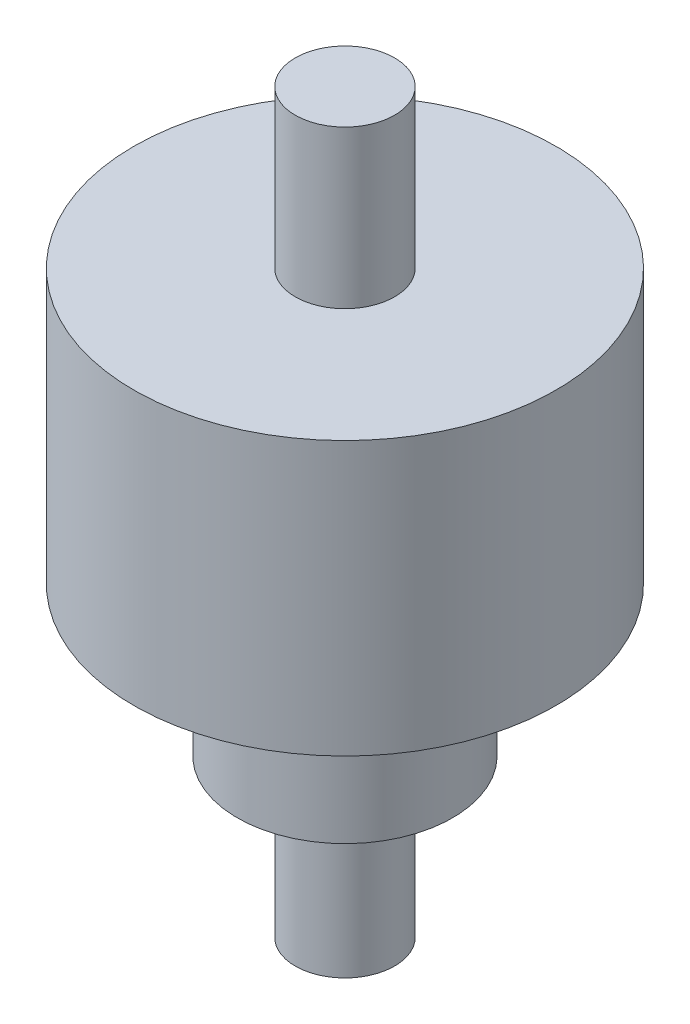
ISO-10303-21;
HEADER;
FILE_DESCRIPTION(('STEP AP214'),'2;1');
FILE_NAME('part.step','',(''),(''),'','','');
FILE_SCHEMA(('AUTOMOTIVE_DESIGN { 1 0 10303 214 1 1 1 1 }'));
ENDSEC;
DATA;
#1=APPLICATION_CONTEXT('core data for automotive mechanical design processes');
#2=APPLICATION_PROTOCOL_DEFINITION('international standard','automotive_design',2000,#1);
#3=PRODUCT_CONTEXT('',#1,'mechanical');
#4=PRODUCT('Part','Part','',(#3));
#5=PRODUCT_RELATED_PRODUCT_CATEGORY('part','',(#4));
#6=PRODUCT_DEFINITION_FORMATION('','',#4);
#7=PRODUCT_DEFINITION_CONTEXT('part definition',#1,'design');
#8=PRODUCT_DEFINITION('design','',#6,#7);
#9=PRODUCT_DEFINITION_SHAPE('','',#8);
#10=(LENGTH_UNIT() NAMED_UNIT(*) SI_UNIT(.MILLI.,.METRE.));
#11=(NAMED_UNIT(*) PLANE_ANGLE_UNIT() SI_UNIT($,.RADIAN.));
#12=(NAMED_UNIT(*) SI_UNIT($,.STERADIAN.) SOLID_ANGLE_UNIT());
#13=UNCERTAINTY_MEASURE_WITH_UNIT(LENGTH_MEASURE(1.E-05),#10,'distance_accuracy_value','');
#14=(GEOMETRIC_REPRESENTATION_CONTEXT(3) GLOBAL_UNCERTAINTY_ASSIGNED_CONTEXT((#13)) GLOBAL_UNIT_ASSIGNED_CONTEXT((#10,
#11,#12)) REPRESENTATION_CONTEXT('',''));
#15=CARTESIAN_POINT('',(0.,0.,0.));
#16=DIRECTION('',(0.,0.,1.));
#17=DIRECTION('',(1.,0.,0.));
#18=AXIS2_PLACEMENT_3D('',#15,#16,#17);
#19=CARTESIAN_POINT('',(25.5,0.,0.));
#20=DIRECTION('',(0.,1.,0.));
#21=DIRECTION('',(-1.,0.,0.));
#22=AXIS2_PLACEMENT_3D('',#19,#20,#21);
#23=PLANE('',#22);
#24=CARTESIAN_POINT('',(0.,0.,0.));
#25=DIRECTION('',(0.,1.,0.));
#26=DIRECTION('',(-1.,0.,0.));
#27=AXIS2_PLACEMENT_3D('',#24,#25,#26);
#28=CIRCLE('',#27,25.5);
#29=CARTESIAN_POINT('',(-25.5,0.,0.));
#30=VERTEX_POINT('',#29);
#31=EDGE_CURVE('E10',#30,#30,#28,.T.);
#32=ORIENTED_EDGE('',*,*,#31,.F.);
#33=EDGE_LOOP('',(#32));
#34=FACE_BOUND('',#33,.T.);
#35=CARTESIAN_POINT('',(0.,0.,0.));
#36=DIRECTION('',(0.,1.,0.));
#37=DIRECTION('',(-1.,0.,0.));
#38=AXIS2_PLACEMENT_3D('',#35,#36,#37);
#39=CIRCLE('',#38,13.);
#40=CARTESIAN_POINT('',(-13.,0.,0.));
#41=VERTEX_POINT('',#40);
#42=EDGE_CURVE('E69',#41,#41,#39,.T.);
#43=ORIENTED_EDGE('',*,*,#42,.T.);
#44=EDGE_LOOP('',(#43));
#45=FACE_BOUND('',#44,.T.);
#46=ADVANCED_FACE('F41',(#34,#45),#23,.F.);
#47=CARTESIAN_POINT('',(0.,52.,0.));
#48=DIRECTION('',(0.,1.,0.));
#49=DIRECTION('',(-1.,0.,0.));
#50=AXIS2_PLACEMENT_3D('',#47,#48,#49);
#51=CYLINDRICAL_SURFACE('',#50,25.5);
#52=CARTESIAN_POINT('',(0.,33.,0.));
#53=DIRECTION('',(0.,1.,0.));
#54=DIRECTION('',(-1.,0.,0.));
#55=AXIS2_PLACEMENT_3D('',#52,#53,#54);
#56=CIRCLE('',#55,25.5);
#57=CARTESIAN_POINT('',(-25.5,33.,0.));
#58=VERTEX_POINT('',#57);
#59=EDGE_CURVE('E47',#58,#58,#56,.T.);
#60=ORIENTED_EDGE('',*,*,#59,.F.);
#61=EDGE_LOOP('',(#60));
#62=FACE_BOUND('',#61,.T.);
#63=ORIENTED_EDGE('',*,*,#31,.T.);
#64=EDGE_LOOP('',(#63));
#65=FACE_BOUND('',#64,.T.);
#66=ADVANCED_FACE('F103',(#62,#65),#51,.T.);
#67=CARTESIAN_POINT('',(25.5,33.,0.));
#68=DIRECTION('',(0.,-1.,0.));
#69=DIRECTION('',(1.,0.,0.));
#70=AXIS2_PLACEMENT_3D('',#67,#68,#69);
#71=PLANE('',#70);
#72=CARTESIAN_POINT('',(0.,33.,0.));
#73=DIRECTION('',(0.,1.,0.));
#74=DIRECTION('',(-1.,0.,0.));
#75=AXIS2_PLACEMENT_3D('',#72,#73,#74);
#76=CIRCLE('',#75,6.);
#77=CARTESIAN_POINT('',(-6.,33.,0.));
#78=VERTEX_POINT('',#77);
#79=EDGE_CURVE('E51',#78,#78,#76,.T.);
#80=ORIENTED_EDGE('',*,*,#79,.F.);
#81=EDGE_LOOP('',(#80));
#82=FACE_BOUND('',#81,.T.);
#83=ORIENTED_EDGE('',*,*,#59,.T.);
#84=EDGE_LOOP('',(#83));
#85=FACE_BOUND('',#84,.T.);
#86=ADVANCED_FACE('F108',(#82,#85),#71,.F.);
#87=CARTESIAN_POINT('',(0.,52.,0.));
#88=DIRECTION('',(0.,1.,0.));
#89=DIRECTION('',(-1.,0.,0.));
#90=AXIS2_PLACEMENT_3D('',#87,#88,#89);
#91=CYLINDRICAL_SURFACE('',#90,6.);
#92=CARTESIAN_POINT('',(0.,52.,0.));
#93=DIRECTION('',(0.,1.,0.));
#94=DIRECTION('',(-1.,0.,0.));
#95=AXIS2_PLACEMENT_3D('',#92,#93,#94);
#96=CIRCLE('',#95,6.);
#97=CARTESIAN_POINT('',(-6.,52.,0.));
#98=VERTEX_POINT('',#97);
#99=EDGE_CURVE('E55',#98,#98,#96,.T.);
#100=ORIENTED_EDGE('',*,*,#99,.F.);
#101=EDGE_LOOP('',(#100));
#102=FACE_BOUND('',#101,.T.);
#103=ORIENTED_EDGE('',*,*,#79,.T.);
#104=EDGE_LOOP('',(#103));
#105=FACE_BOUND('',#104,.T.);
#106=ADVANCED_FACE('F99',(#102,#105),#91,.T.);
#107=CARTESIAN_POINT('',(6.,52.,0.));
#108=DIRECTION('',(0.,-1.,0.));
#109=DIRECTION('',(1.,0.,0.));
#110=AXIS2_PLACEMENT_3D('',#107,#108,#109);
#111=PLANE('',#110);
#112=ORIENTED_EDGE('',*,*,#99,.T.);
#113=EDGE_LOOP('',(#112));
#114=FACE_BOUND('',#113,.T.);
#115=ADVANCED_FACE('F94',(#114),#111,.F.);
#116=CARTESIAN_POINT('',(6.,-37.,0.));
#117=DIRECTION('',(0.,1.,0.));
#118=DIRECTION('',(-1.,0.,0.));
#119=AXIS2_PLACEMENT_3D('',#116,#117,#118);
#120=PLANE('',#119);
#121=CARTESIAN_POINT('',(0.,-37.,0.));
#122=DIRECTION('',(0.,1.,0.));
#123=DIRECTION('',(-1.,0.,0.));
#124=AXIS2_PLACEMENT_3D('',#121,#122,#123);
#125=CIRCLE('',#124,6.);
#126=CARTESIAN_POINT('',(-6.,-37.,0.));
#127=VERTEX_POINT('',#126);
#128=EDGE_CURVE('E60',#127,#127,#125,.T.);
#129=ORIENTED_EDGE('',*,*,#128,.F.);
#130=EDGE_LOOP('',(#129));
#131=FACE_BOUND('',#130,.T.);
#132=ADVANCED_FACE('F89',(#131),#120,.F.);
#133=CARTESIAN_POINT('',(0.,52.,0.));
#134=DIRECTION('',(0.,1.,0.));
#135=DIRECTION('',(-1.,0.,0.));
#136=AXIS2_PLACEMENT_3D('',#133,#134,#135);
#137=CYLINDRICAL_SURFACE('',#136,6.);
#138=CARTESIAN_POINT('',(0.,-18.,0.));
#139=DIRECTION('',(0.,1.,0.));
#140=DIRECTION('',(-1.,0.,0.));
#141=AXIS2_PLACEMENT_3D('',#138,#139,#140);
#142=CIRCLE('',#141,6.);
#143=CARTESIAN_POINT('',(-6.,-18.,0.));
#144=VERTEX_POINT('',#143);
#145=EDGE_CURVE('E63',#144,#144,#142,.T.);
#146=ORIENTED_EDGE('',*,*,#145,.F.);
#147=EDGE_LOOP('',(#146));
#148=FACE_BOUND('',#147,.T.);
#149=ORIENTED_EDGE('',*,*,#128,.T.);
#150=EDGE_LOOP('',(#149));
#151=FACE_BOUND('',#150,.T.);
#152=ADVANCED_FACE('F83',(#148,#151),#137,.T.);
#153=CARTESIAN_POINT('',(13.,-18.,0.));
#154=DIRECTION('',(0.,1.,0.));
#155=DIRECTION('',(-1.,0.,0.));
#156=AXIS2_PLACEMENT_3D('',#153,#154,#155);
#157=PLANE('',#156);
#158=CARTESIAN_POINT('',(0.,-18.,0.));
#159=DIRECTION('',(0.,1.,0.));
#160=DIRECTION('',(-1.,0.,0.));
#161=AXIS2_PLACEMENT_3D('',#158,#159,#160);
#162=CIRCLE('',#161,13.);
#163=CARTESIAN_POINT('',(-13.,-18.,0.));
#164=VERTEX_POINT('',#163);
#165=EDGE_CURVE('E66',#164,#164,#162,.T.);
#166=ORIENTED_EDGE('',*,*,#165,.F.);
#167=EDGE_LOOP('',(#166));
#168=FACE_BOUND('',#167,.T.);
#169=ORIENTED_EDGE('',*,*,#145,.T.);
#170=EDGE_LOOP('',(#169));
#171=FACE_BOUND('',#170,.T.);
#172=ADVANCED_FACE('F77',(#168,#171),#157,.F.);
#173=CARTESIAN_POINT('',(0.,52.,0.));
#174=DIRECTION('',(0.,1.,0.));
#175=DIRECTION('',(-1.,0.,0.));
#176=AXIS2_PLACEMENT_3D('',#173,#174,#175);
#177=CYLINDRICAL_SURFACE('',#176,13.);
#178=ORIENTED_EDGE('',*,*,#42,.F.);
#179=EDGE_LOOP('',(#178));
#180=FACE_BOUND('',#179,.T.);
#181=ORIENTED_EDGE('',*,*,#165,.T.);
#182=EDGE_LOOP('',(#181));
#183=FACE_BOUND('',#182,.T.);
#184=ADVANCED_FACE('F74',(#180,#183),#177,.T.);
#185=CLOSED_SHELL('',(#46,#66,#86,#106,#115,#132,#152,#172,#184));
#186=MANIFOLD_SOLID_BREP('B2',#185);
#187=ADVANCED_BREP_SHAPE_REPRESENTATION('',(#18,#186),#14);
#188=SHAPE_DEFINITION_REPRESENTATION(#9,#187);
ENDSEC;
END-ISO-10303-21;
